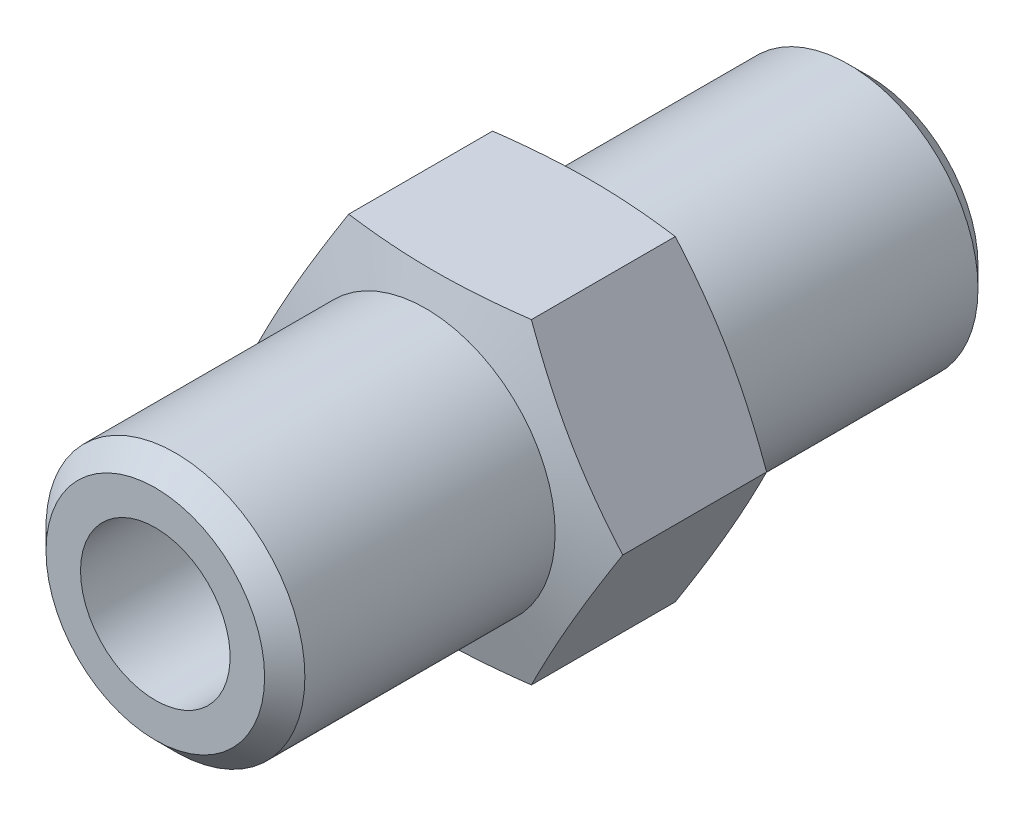
ISO-10303-21;
HEADER;
FILE_DESCRIPTION(('STEP AP214'),'2;1');
FILE_NAME('part.step','',(''),(''),'','','');
FILE_SCHEMA(('AUTOMOTIVE_DESIGN { 1 0 10303 214 1 1 1 1 }'));
ENDSEC;
DATA;
#1=APPLICATION_CONTEXT('core data for automotive mechanical design processes');
#2=APPLICATION_PROTOCOL_DEFINITION('international standard','automotive_design',2000,#1);
#3=PRODUCT_CONTEXT('',#1,'mechanical');
#4=PRODUCT('Part','Part','',(#3));
#5=PRODUCT_RELATED_PRODUCT_CATEGORY('part','',(#4));
#6=PRODUCT_DEFINITION_FORMATION('','',#4);
#7=PRODUCT_DEFINITION_CONTEXT('part definition',#1,'design');
#8=PRODUCT_DEFINITION('design','',#6,#7);
#9=PRODUCT_DEFINITION_SHAPE('','',#8);
#10=(LENGTH_UNIT() NAMED_UNIT(*) SI_UNIT(.MILLI.,.METRE.));
#11=(NAMED_UNIT(*) PLANE_ANGLE_UNIT() SI_UNIT($,.RADIAN.));
#12=(NAMED_UNIT(*) SI_UNIT($,.STERADIAN.) SOLID_ANGLE_UNIT());
#13=UNCERTAINTY_MEASURE_WITH_UNIT(LENGTH_MEASURE(1.E-05),#10,'distance_accuracy_value','');
#14=(GEOMETRIC_REPRESENTATION_CONTEXT(3) GLOBAL_UNCERTAINTY_ASSIGNED_CONTEXT((#13)) GLOBAL_UNIT_ASSIGNED_CONTEXT((#10,
#11,#12)) REPRESENTATION_CONTEXT('',''));
#15=CARTESIAN_POINT('',(0.,0.,0.));
#16=DIRECTION('',(0.,0.,1.));
#17=DIRECTION('',(1.,0.,0.));
#18=AXIS2_PLACEMENT_3D('',#15,#16,#17);
#19=CARTESIAN_POINT('',(3.17542648054292,-5.50000000000003,3.));
#20=DIRECTION('',(-0.86602540378444,0.499999999999998,0.));
#21=DIRECTION('',(-0.499999999999998,-0.86602540378444,0.));
#22=AXIS2_PLACEMENT_3D('',#19,#20,#21);
#23=PLANE('',#22);
#24=CARTESIAN_POINT('',(6.35096843113971,0.00020000000001517,-2.49996880540882));
#25=CARTESIAN_POINT('',(6.21909857753245,-0.228205286434418,-2.53560827067485));
#26=CARTESIAN_POINT('',(6.08698575690806,-0.457031404087093,-2.56796434186976));
#27=CARTESIAN_POINT('',(5.82228587664242,-0.915505045464598,-2.62481250126896));
#28=CARTESIAN_POINT('',(5.68969864384062,-1.14515286911228,-2.64930133971248));
#29=CARTESIAN_POINT('',(5.42486694275772,-1.60385483084275,-2.68898192793889));
#30=CARTESIAN_POINT('',(5.29262432452593,-1.83290576454614,-2.70422177046429));
#31=CARTESIAN_POINT('',(5.02796768521281,-2.2913045103969,-2.7246569593401));
#32=CARTESIAN_POINT('',(4.8955537030136,-2.52065225519845,-2.7298542831265));
#33=CARTESIAN_POINT('',(4.63072573861518,-2.97934774480156,-2.7298542831265));
#34=CARTESIAN_POINT('',(4.49831175641597,-3.20869548960311,-2.7246569593401));
#35=CARTESIAN_POINT('',(4.23365511710285,-3.66709423545387,-2.70422177046429));
#36=CARTESIAN_POINT('',(4.10141249887106,-3.89614516915726,-2.68898192793888));
#37=CARTESIAN_POINT('',(3.83658079778817,-4.35484713088773,-2.64930133971248));
#38=CARTESIAN_POINT('',(3.70399356498637,-4.58449495453541,-2.62481250126896));
#39=CARTESIAN_POINT('',(3.43929368472072,-5.04296859591292,-2.56796434186975));
#40=CARTESIAN_POINT('',(3.30718086409633,-5.27179471356559,-2.53560827067485));
#41=CARTESIAN_POINT('',(3.17531101048908,-5.50020000000003,-2.49996880540881));
#42=B_SPLINE_CURVE_WITH_KNOTS('',3,(#24,#25,#26,#27,#28,#29,#30,#31,#32,#33,#34,#35,#36,#37,#38,
#39,#40,#41),.UNSPECIFIED.,.F.,.F.,(4,2,2,2,2,2,2,2,4),(0.,0.798453028022411,1.59723545457054,
2.39182798445062,3.18626403804335,3.98070009163608,4.77529262151615,5.57407504806429,
6.3725280760867),.UNSPECIFIED.);
#43=CARTESIAN_POINT('',(6.35085296108592,0.,-2.5));
#44=VERTEX_POINT('',#43);
#45=CARTESIAN_POINT('',(3.17542648054292,-5.50000000000003,-2.5));
#46=VERTEX_POINT('',#45);
#47=EDGE_CURVE('E50',#44,#46,#42,.T.);
#48=ORIENTED_EDGE('',*,*,#47,.F.);
#49=DIRECTION('',(0.,0.,-1.));
#50=VECTOR('',#49,1.);
#51=CARTESIAN_POINT('',(6.35085296108587,0.,3.));
#52=LINE('',#51,#50);
#53=CARTESIAN_POINT('',(6.35085296108592,0.,2.5));
#54=VERTEX_POINT('',#53);
#55=EDGE_CURVE('E99',#54,#44,#52,.T.);
#56=ORIENTED_EDGE('',*,*,#55,.F.);
#57=CARTESIAN_POINT('',(3.17531101048908,-5.50020000000003,2.49996880540881));
#58=CARTESIAN_POINT('',(3.30718086409633,-5.27179471356559,2.53560827067485));
#59=CARTESIAN_POINT('',(3.43929368472072,-5.04296859591292,2.56796434186975));
#60=CARTESIAN_POINT('',(3.70399356498637,-4.58449495453541,2.62481250126896));
#61=CARTESIAN_POINT('',(3.83658079778817,-4.35484713088773,2.64930133971248));
#62=CARTESIAN_POINT('',(4.10141249887106,-3.89614516915726,2.68898192793889));
#63=CARTESIAN_POINT('',(4.23365511710285,-3.66709423545387,2.70422177046429));
#64=CARTESIAN_POINT('',(4.49831175641597,-3.20869548960311,2.7246569593401));
#65=CARTESIAN_POINT('',(4.63072573861518,-2.97934774480156,2.7298542831265));
#66=CARTESIAN_POINT('',(4.8955537030136,-2.52065225519845,2.7298542831265));
#67=CARTESIAN_POINT('',(5.02796768521281,-2.2913045103969,2.7246569593401));
#68=CARTESIAN_POINT('',(5.29262432452594,-1.83290576454614,2.70422177046429));
#69=CARTESIAN_POINT('',(5.42486694275772,-1.60385483084275,2.68898192793889));
#70=CARTESIAN_POINT('',(5.68969864384062,-1.14515286911228,2.64930133971248));
#71=CARTESIAN_POINT('',(5.82228587664242,-0.915505045464597,2.62481250126896));
#72=CARTESIAN_POINT('',(6.08698575690807,-0.457031404087092,2.56796434186976));
#73=CARTESIAN_POINT('',(6.21909857753245,-0.228205286434417,2.53560827067485));
#74=CARTESIAN_POINT('',(6.35096843113971,0.000200000000016106,2.49996880540882));
#75=B_SPLINE_CURVE_WITH_KNOTS('',3,(#57,#58,#59,#60,#61,#62,#63,#64,#65,#66,#67,#68,#69,#70,#71,
#72,#73,#74),.UNSPECIFIED.,.F.,.F.,(4,2,2,2,2,2,2,2,4),(0.,0.79845302802241,1.59723545457054,
2.39182798445062,3.18626403804335,3.98070009163608,4.77529262151615,5.57407504806429,
6.3725280760867),.UNSPECIFIED.);
#76=CARTESIAN_POINT('',(3.17542648054298,-5.50000000000003,2.5));
#77=VERTEX_POINT('',#76);
#78=EDGE_CURVE('E144',#77,#54,#75,.T.);
#79=ORIENTED_EDGE('',*,*,#78,.F.);
#80=DIRECTION('',(0.,0.,-1.));
#81=VECTOR('',#80,1.);
#82=CARTESIAN_POINT('',(3.17542648054292,-5.50000000000003,3.));
#83=LINE('',#82,#81);
#84=EDGE_CURVE('E101',#77,#46,#83,.T.);
#85=ORIENTED_EDGE('',*,*,#84,.T.);
#86=EDGE_LOOP('',(#48,#56,#79,#85));
#87=FACE_BOUND('',#86,.T.);
#88=ADVANCED_FACE('F35',(#87),#23,.F.);
#89=CARTESIAN_POINT('',(6.35085296108587,0.,3.));
#90=DIRECTION('',(-0.866025403784438,-0.500000000000001,0.));
#91=DIRECTION('',(0.500000000000001,-0.866025403784438,0.));
#92=AXIS2_PLACEMENT_3D('',#89,#90,#91);
#93=PLANE('',#92);
#94=CARTESIAN_POINT('',(3.17531101048906,5.50020000000005,-2.49996880540881));
#95=CARTESIAN_POINT('',(3.30718086409631,5.27179471356561,-2.53560827067484));
#96=CARTESIAN_POINT('',(3.4392936847207,5.04296859591294,-2.56796434186975));
#97=CARTESIAN_POINT('',(3.70399356498635,4.58449495453543,-2.62481250126896));
#98=CARTESIAN_POINT('',(3.83658079778815,4.35484713088775,-2.64930133971247));
#99=CARTESIAN_POINT('',(4.10141249887105,3.89614516915728,-2.68898192793888));
#100=CARTESIAN_POINT('',(4.23365511710284,3.66709423545389,-2.70422177046428));
#101=CARTESIAN_POINT('',(4.49831175641596,3.20869548960313,-2.7246569593401));
#102=CARTESIAN_POINT('',(4.63072573861518,2.97934774480158,-2.7298542831265));
#103=CARTESIAN_POINT('',(4.8955537030136,2.52065225519847,-2.7298542831265));
#104=CARTESIAN_POINT('',(5.02796768521281,2.29130451039692,-2.7246569593401));
#105=CARTESIAN_POINT('',(5.29262432452593,1.83290576454615,-2.70422177046429));
#106=CARTESIAN_POINT('',(5.42486694275772,1.60385483084276,-2.68898192793889));
#107=CARTESIAN_POINT('',(5.68969864384062,1.14515286911229,-2.64930133971248));
#108=CARTESIAN_POINT('',(5.82228587664242,0.915505045464613,-2.62481250126896));
#109=CARTESIAN_POINT('',(6.08698575690807,0.457031404087108,-2.56796434186976));
#110=CARTESIAN_POINT('',(6.21909857753246,0.228205286434434,-2.53560827067485));
#111=CARTESIAN_POINT('',(6.35096843113971,-0.000200000000000651,-2.49996880540882));
#112=B_SPLINE_CURVE_WITH_KNOTS('',3,(#94,#95,#96,#97,#98,#99,#100,#101,#102,#103,#104,#105,#106,
#107,#108,#109,#110,#111),.UNSPECIFIED.,.F.,.F.,(4,2,2,2,2,2,2,2,4),(0.,0.798453028022413,
1.59723545457055,2.39182798445063,3.18626403804336,3.98070009163609,4.77529262151617,
5.5740750480643,6.37252807608672),.UNSPECIFIED.);
#113=CARTESIAN_POINT('',(3.17542648054294,5.50000000000005,-2.5));
#114=VERTEX_POINT('',#113);
#115=EDGE_CURVE('E86',#114,#44,#112,.T.);
#116=ORIENTED_EDGE('',*,*,#115,.F.);
#117=DIRECTION('',(0.,0.,-1.));
#118=VECTOR('',#117,1.);
#119=CARTESIAN_POINT('',(3.1754264805429,5.50000000000005,3.));
#120=LINE('',#119,#118);
#121=CARTESIAN_POINT('',(3.17542648054294,5.50000000000005,2.5));
#122=VERTEX_POINT('',#121);
#123=EDGE_CURVE('E108',#122,#114,#120,.T.);
#124=ORIENTED_EDGE('',*,*,#123,.F.);
#125=CARTESIAN_POINT('',(6.35096843113971,-0.000199999999984875,2.49996880540882));
#126=CARTESIAN_POINT('',(6.21909857753245,0.228205286434449,2.53560827067485));
#127=CARTESIAN_POINT('',(6.08698575690806,0.457031404087123,2.56796434186976));
#128=CARTESIAN_POINT('',(5.82228587664241,0.915505045464627,2.62481250126896));
#129=CARTESIAN_POINT('',(5.68969864384061,1.14515286911231,2.64930133971248));
#130=CARTESIAN_POINT('',(5.42486694275772,1.60385483084277,2.68898192793889));
#131=CARTESIAN_POINT('',(5.29262432452593,1.83290576454616,2.70422177046429));
#132=CARTESIAN_POINT('',(5.0279676852128,2.29130451039693,2.7246569593401));
#133=CARTESIAN_POINT('',(4.89555370301359,2.52065225519848,2.7298542831265));
#134=CARTESIAN_POINT('',(4.63072573861517,2.97934774480158,2.7298542831265));
#135=CARTESIAN_POINT('',(4.49831175641596,3.20869548960314,2.7246569593401));
#136=CARTESIAN_POINT('',(4.23365511710284,3.6670942354539,2.70422177046428));
#137=CARTESIAN_POINT('',(4.10141249887105,3.89614516915729,2.68898192793888));
#138=CARTESIAN_POINT('',(3.83658079778815,4.35484713088776,2.64930133971247));
#139=CARTESIAN_POINT('',(3.70399356498635,4.58449495453544,2.62481250126896));
#140=CARTESIAN_POINT('',(3.4392936847207,5.04296859591294,2.56796434186975));
#141=CARTESIAN_POINT('',(3.30718086409631,5.27179471356561,2.53560827067484));
#142=CARTESIAN_POINT('',(3.17531101048906,5.50020000000005,2.49996880540881));
#143=B_SPLINE_CURVE_WITH_KNOTS('',3,(#125,#126,#127,#128,#129,#130,#131,#132,#133,#134,#135,
#136,#137,#138,#139,#140,#141,#142),.UNSPECIFIED.,.F.,.F.,(4,2,2,2,2,2,2,2,4),(0.,
0.798453028022411,1.59723545457054,2.39182798445062,3.18626403804335,3.98070009163608,
4.77529262151615,5.57407504806429,6.3725280760867),.UNSPECIFIED.);
#144=EDGE_CURVE('E106',#54,#122,#143,.T.);
#145=ORIENTED_EDGE('',*,*,#144,.F.);
#146=ORIENTED_EDGE('',*,*,#55,.T.);
#147=EDGE_LOOP('',(#116,#124,#145,#146));
#148=FACE_BOUND('',#147,.T.);
#149=ADVANCED_FACE('F105',(#148),#93,.F.);
#150=CARTESIAN_POINT('',(3.1754264805429,5.50000000000005,3.));
#151=DIRECTION('',(0.,-1.,0.));
#152=DIRECTION('',(0.,0.,-1.));
#153=AXIS2_PLACEMENT_3D('',#150,#151,#152);
#154=PLANE('',#153);
#155=CARTESIAN_POINT('',(-8.37604764917882,5.50000000000005,-1.50869084585545));
#156=CARTESIAN_POINT('',(-8.12680145019275,5.50000000000005,-1.56495914991918));
#157=CARTESIAN_POINT('',(-7.87739624035822,5.50000000000005,-1.62053578772309));
#158=CARTESIAN_POINT('',(-7.37818970420281,5.50000000000005,-1.72993219848236));
#159=CARTESIAN_POINT('',(-7.12838836084236,5.50000000000005,-1.78375189358873));
#160=CARTESIAN_POINT('',(-6.62808086018437,5.50000000000005,-1.88930914543803));
#161=CARTESIAN_POINT('',(-6.37757424575021,5.50000000000005,-1.9410445432589));
#162=CARTESIAN_POINT('',(-5.87602950686094,5.50000000000005,-2.04186994899429));
#163=CARTESIAN_POINT('',(-5.62499138703514,5.50000000000005,-2.09095997985181));
#164=CARTESIAN_POINT('',(-5.1243510925801,5.50000000000005,-2.18547555450788));
#165=CARTESIAN_POINT('',(-4.87475398508629,5.50000000000005,-2.23092780578391));
#166=CARTESIAN_POINT('',(-4.37486670922052,5.50000000000005,-2.31783907452348));
#167=CARTESIAN_POINT('',(-4.12457655659067,5.50000000000005,-2.35929818193585));
#168=CARTESIAN_POINT('',(-3.6232563207886,5.50000000000005,-2.43728407256187));
#169=CARTESIAN_POINT('',(-3.37222634027827,5.50000000000005,-2.47381150996572));
#170=CARTESIAN_POINT('',(-2.86935537269727,5.50000000000005,-2.54085242863196));
#171=CARTESIAN_POINT('',(-2.61751438494814,5.50000000000005,-2.571365904862));
#172=CARTESIAN_POINT('',(-2.11013760742528,5.50000000000005,-2.62551391211825));
#173=CARTESIAN_POINT('',(-1.8545927606818,5.50000000000005,-2.64906484304505));
#174=CARTESIAN_POINT('',(-1.34285532977527,5.50000000000005,-2.68764901723002));
#175=CARTESIAN_POINT('',(-1.08666276091749,5.50000000000005,-2.70268245989629));
#176=CARTESIAN_POINT('',(-0.574007904718304,5.50000000000005,-2.72335257203808));
#177=CARTESIAN_POINT('',(-0.317545793347686,5.50000000000005,-2.72899351786242));
#178=CARTESIAN_POINT('',(0.195408150510478,5.50000000000005,-2.73053187554643));
#179=CARTESIAN_POINT('',(0.451899982987166,5.50000000000005,-2.72642929095471));
#180=CARTESIAN_POINT('',(0.965509156636248,5.50000000000005,-2.7087110378046));
#181=CARTESIAN_POINT('',(1.22262524669248,5.50000000000005,-2.69505982707376));
#182=CARTESIAN_POINT('',(1.73623879652311,5.50000000000005,-2.65902181815087));
#183=CARTESIAN_POINT('',(1.99273624231407,5.50000000000005,-2.63663482432854));
#184=CARTESIAN_POINT('',(2.50511237094907,5.50000000000005,-2.58425144800659));
#185=CARTESIAN_POINT('',(2.76099053216907,5.50000000000005,-2.55425004111006));
#186=CARTESIAN_POINT('',(3.2719105634027,5.50000000000005,-2.48788021733587));
#187=CARTESIAN_POINT('',(3.52695243099645,5.50000000000005,-2.45151178205128));
#188=CARTESIAN_POINT('',(4.02090404693948,5.50000000000005,-2.3759102253628));
#189=CARTESIAN_POINT('',(4.25986081942583,5.50000000000005,-2.3369812829339));
#190=CARTESIAN_POINT('',(4.73713253888051,5.50000000000005,-2.25535241820544));
#191=CARTESIAN_POINT('',(4.97544746766028,5.50000000000005,-2.21265239017578));
#192=CARTESIAN_POINT('',(5.45152539276521,5.50000000000005,-2.12417526713858));
#193=CARTESIAN_POINT('',(5.6892883361756,5.50000000000005,-2.07839788878471));
#194=CARTESIAN_POINT('',(6.16431794625488,5.50000000000005,-1.98433087059592));
#195=CARTESIAN_POINT('',(6.40158460634305,5.50000000000005,-1.93604119766484));
#196=CARTESIAN_POINT('',(7.11285504480321,5.50000000000005,-1.78808911835104));
#197=CARTESIAN_POINT('',(7.58622111316099,5.50000000000005,-1.68536421558975));
#198=CARTESIAN_POINT('',(8.5316777617362,5.50000000000005,-1.47438969598058));
#199=CARTESIAN_POINT('',(9.003768416739,5.50000000000005,-1.36614041080457));
#200=CARTESIAN_POINT('',(9.94222166980468,5.50000000000005,-1.14687990319113));
#201=CARTESIAN_POINT('',(10.4085935229104,5.50000000000005,-1.03590818449741));
#202=CARTESIAN_POINT('',(11.3406801840764,5.50000000000005,-0.811209444707597));
#203=CARTESIAN_POINT('',(11.806394979696,5.50000000000005,-0.697482372163423));
#204=CARTESIAN_POINT('',(12.7367389906961,5.50000000000005,-0.468137481058403));
#205=CARTESIAN_POINT('',(13.2013688351624,5.50000000000005,-0.352522209350266));
#206=CARTESIAN_POINT('',(14.1302201586133,5.50000000000005,-0.119727189775686));
#207=CARTESIAN_POINT('',(14.5944416507604,5.50000000000005,-0.00254749446411019));
#208=CARTESIAN_POINT('',(15.0585209823324,5.50000000000005,0.115185855876627));
#209=B_SPLINE_CURVE_WITH_KNOTS('',3,(#155,#156,#157,#158,#159,#160,#161,#162,#163,#164,#165,
#166,#167,#168,#169,#170,#171,#172,#173,#174,#175,#176,#177,#178,#179,#180,#181,#182,#183,#184,
#185,#186,#187,#188,#189,#190,#191,#192,#193,#194,#195,#196,#197,#198,#199,#200,#201,#202,#203,
#204,#205,#206,#207,#208),.UNSPECIFIED.,.F.,.F.,(4,2,2,2,2,2,2,2,2,2,2,2,2,2,2,2,2,2,2,2,2,2,2,
2,2,2,4),(0.,0.766559204635087,1.53315232903127,2.30052008367675,3.06788118194892,
3.82896078601792,4.59002324213275,5.35098464327108,6.11194668116364,6.8817056275536,
7.65144655190546,8.42083692179503,9.19022701147073,9.96249629346691,10.7347828707559,
11.5075803749602,12.280380113341,13.0066653942776,13.7329710445748,14.4593436611396,
15.1857258491315,16.6388204904091,18.0918279934541,19.5299944417313,20.9681877642431,
22.4045795623671,23.8409232275095),.UNSPECIFIED.);
#210=CARTESIAN_POINT('',(-3.17542648054296,5.50000000000003,-2.5));
#211=VERTEX_POINT('',#210);
#212=EDGE_CURVE('E89',#211,#114,#209,.T.);
#213=ORIENTED_EDGE('',*,*,#212,.F.);
#214=DIRECTION('',(0.,0.,-1.));
#215=VECTOR('',#214,1.);
#216=CARTESIAN_POINT('',(-3.17542648054295,5.50000000000005,3.));
#217=LINE('',#216,#215);
#218=CARTESIAN_POINT('',(-3.17542648054296,5.50000000000003,2.5));
#219=VERTEX_POINT('',#218);
#220=EDGE_CURVE('E113',#219,#211,#217,.T.);
#221=ORIENTED_EDGE('',*,*,#220,.F.);
#222=CARTESIAN_POINT('',(-8.37604764917882,5.50000000000005,1.50869084585545));
#223=CARTESIAN_POINT('',(-8.12680145019275,5.50000000000005,1.56495914991918));
#224=CARTESIAN_POINT('',(-7.87739624035822,5.50000000000005,1.62053578772309));
#225=CARTESIAN_POINT('',(-7.37818970420281,5.50000000000005,1.72993219848236));
#226=CARTESIAN_POINT('',(-7.12838836084236,5.50000000000005,1.78375189358873));
#227=CARTESIAN_POINT('',(-6.62808086018437,5.50000000000005,1.88930914543803));
#228=CARTESIAN_POINT('',(-6.37757424575021,5.50000000000005,1.9410445432589));
#229=CARTESIAN_POINT('',(-5.87602950686094,5.50000000000005,2.04186994899429));
#230=CARTESIAN_POINT('',(-5.62499138703514,5.50000000000005,2.09095997985181));
#231=CARTESIAN_POINT('',(-5.1243510925801,5.50000000000005,2.18547555450788));
#232=CARTESIAN_POINT('',(-4.8747539850863,5.50000000000005,2.23092780578391));
#233=CARTESIAN_POINT('',(-4.37486670922052,5.50000000000005,2.31783907452348));
#234=CARTESIAN_POINT('',(-4.12457655659067,5.50000000000005,2.35929818193585));
#235=CARTESIAN_POINT('',(-3.6232563207886,5.50000000000005,2.43728407256187));
#236=CARTESIAN_POINT('',(-3.37222634027827,5.50000000000005,2.47381150996572));
#237=CARTESIAN_POINT('',(-2.86935537269727,5.50000000000005,2.54085242863196));
#238=CARTESIAN_POINT('',(-2.61751438494814,5.50000000000005,2.571365904862));
#239=CARTESIAN_POINT('',(-2.11013760742528,5.50000000000005,2.62551391211825));
#240=CARTESIAN_POINT('',(-1.85459276068179,5.50000000000005,2.64906484304505));
#241=CARTESIAN_POINT('',(-1.34285532977526,5.50000000000005,2.68764901723002));
#242=CARTESIAN_POINT('',(-1.08666276091749,5.50000000000005,2.70268245989629));
#243=CARTESIAN_POINT('',(-0.5740079047183,5.50000000000005,2.72335257203808));
#244=CARTESIAN_POINT('',(-0.317545793347681,5.50000000000005,2.72899351786242));
#245=CARTESIAN_POINT('',(0.195408150510483,5.50000000000005,2.73053187554643));
#246=CARTESIAN_POINT('',(0.451899982987171,5.50000000000005,2.72642929095471));
#247=CARTESIAN_POINT('',(0.965509156636253,5.50000000000005,2.7087110378046));
#248=CARTESIAN_POINT('',(1.22262524669248,5.50000000000005,2.69505982707376));
#249=CARTESIAN_POINT('',(1.73623879652311,5.50000000000005,2.65902181815087));
#250=CARTESIAN_POINT('',(1.99273624231407,5.50000000000005,2.63663482432854));
#251=CARTESIAN_POINT('',(2.50511237094908,5.50000000000005,2.58425144800659));
#252=CARTESIAN_POINT('',(2.76099053216908,5.50000000000005,2.55425004111006));
#253=CARTESIAN_POINT('',(3.27191056340271,5.50000000000005,2.48788021733587));
#254=CARTESIAN_POINT('',(3.52695243099646,5.50000000000005,2.45151178205128));
#255=CARTESIAN_POINT('',(4.02090404693948,5.50000000000005,2.3759102253628));
#256=CARTESIAN_POINT('',(4.25986081942583,5.50000000000005,2.3369812829339));
#257=CARTESIAN_POINT('',(4.7371325388805,5.50000000000005,2.25535241820544));
#258=CARTESIAN_POINT('',(4.97544746766027,5.50000000000005,2.21265239017578));
#259=CARTESIAN_POINT('',(5.4515253927652,5.50000000000005,2.12417526713858));
#260=CARTESIAN_POINT('',(5.68928833617558,5.50000000000005,2.07839788878471));
#261=CARTESIAN_POINT('',(6.16431794625486,5.50000000000005,1.98433087059593));
#262=CARTESIAN_POINT('',(6.40158460634302,5.50000000000005,1.93604119766484));
#263=CARTESIAN_POINT('',(7.11285504480318,5.50000000000005,1.78808911835105));
#264=CARTESIAN_POINT('',(7.58622111316096,5.50000000000005,1.68536421558975));
#265=CARTESIAN_POINT('',(8.53167776173616,5.50000000000005,1.47438969598059));
#266=CARTESIAN_POINT('',(9.00376841673895,5.50000000000005,1.36614041080458));
#267=CARTESIAN_POINT('',(9.94222166980463,5.50000000000005,1.14687990319114));
#268=CARTESIAN_POINT('',(10.4085935229104,5.50000000000005,1.03590818449742));
#269=CARTESIAN_POINT('',(11.3406801840763,5.50000000000005,0.811209444707612));
#270=CARTESIAN_POINT('',(11.8063949796959,5.50000000000005,0.697482372163439));
#271=CARTESIAN_POINT('',(12.7367389906961,5.50000000000005,0.46813748105842));
#272=CARTESIAN_POINT('',(13.2013688351623,5.50000000000005,0.352522209350284));
#273=CARTESIAN_POINT('',(14.1302201586133,5.50000000000005,0.119727189775706));
#274=CARTESIAN_POINT('',(14.5944416507604,5.50000000000005,0.00254749446413092));
#275=CARTESIAN_POINT('',(15.0585209823323,5.50000000000005,-0.115185855876605));
#276=B_SPLINE_CURVE_WITH_KNOTS('',3,(#222,#223,#224,#225,#226,#227,#228,#229,#230,#231,#232,
#233,#234,#235,#236,#237,#238,#239,#240,#241,#242,#243,#244,#245,#246,#247,#248,#249,#250,#251,
#252,#253,#254,#255,#256,#257,#258,#259,#260,#261,#262,#263,#264,#265,#266,#267,#268,#269,#270,
#271,#272,#273,#274,#275),.UNSPECIFIED.,.F.,.F.,(4,2,2,2,2,2,2,2,2,2,2,2,2,2,2,2,2,2,2,2,2,2,2,
2,2,2,4),(0.,0.766559204635087,1.53315232903128,2.30052008367675,3.06788118194891,
3.82896078601792,4.59002324213275,5.35098464327108,6.11194668116364,6.88170562755361,
7.65144655190546,8.42083692179503,9.19022701147073,9.96249629346692,10.7347828707559,
11.5075803749602,12.280380113341,13.0066653942776,13.7329710445748,14.4593436611396,
15.1857258491315,16.638820490409,18.0918279934541,19.5299944417313,20.9681877642431,
22.404579562367,23.8409232275094),.UNSPECIFIED.);
#277=EDGE_CURVE('E202',#122,#219,#276,.F.);
#278=ORIENTED_EDGE('',*,*,#277,.F.);
#279=ORIENTED_EDGE('',*,*,#123,.T.);
#280=EDGE_LOOP('',(#213,#221,#278,#279));
#281=FACE_BOUND('',#280,.T.);
#282=ADVANCED_FACE('F137',(#281),#154,.F.);
#283=CARTESIAN_POINT('',(-3.17542648054295,5.50000000000005,3.));
#284=DIRECTION('',(0.866025403784439,-0.499999999999999,0.));
#285=DIRECTION('',(0.499999999999999,0.866025403784439,0.));
#286=AXIS2_PLACEMENT_3D('',#283,#284,#285);
#287=PLANE('',#286);
#288=CARTESIAN_POINT('',(-6.35096843113976,-0.00020000000000847,-2.49996880540881));
#289=CARTESIAN_POINT('',(-6.21909857753251,0.228205286434426,-2.53560827067484));
#290=CARTESIAN_POINT('',(-6.08698575690812,0.457031404087101,-2.56796434186974));
#291=CARTESIAN_POINT('',(-5.82228587664247,0.915505045464607,-2.62481250126895));
#292=CARTESIAN_POINT('',(-5.68969864384067,1.14515286911229,-2.64930133971247));
#293=CARTESIAN_POINT('',(-5.42486694275777,1.60385483084276,-2.68898192793888));
#294=CARTESIAN_POINT('',(-5.29262432452598,1.83290576454615,-2.70422177046427));
#295=CARTESIAN_POINT('',(-5.02796768521286,2.29130451039691,-2.72465695934009));
#296=CARTESIAN_POINT('',(-4.89555370301365,2.52065225519847,-2.72985428312649));
#297=CARTESIAN_POINT('',(-4.63072573861523,2.97934774480157,-2.72985428312649));
#298=CARTESIAN_POINT('',(-4.49831175641602,3.20869548960313,-2.72465695934009));
#299=CARTESIAN_POINT('',(-4.23365511710289,3.66709423545389,-2.70422177046427));
#300=CARTESIAN_POINT('',(-4.10141249887111,3.89614516915728,-2.68898192793887));
#301=CARTESIAN_POINT('',(-3.83658079778821,4.35484713088775,-2.64930133971246));
#302=CARTESIAN_POINT('',(-3.70399356498641,4.58449495453543,-2.62481250126895));
#303=CARTESIAN_POINT('',(-3.43929368472076,5.04296859591294,-2.56796434186974));
#304=CARTESIAN_POINT('',(-3.30718086409637,5.27179471356561,-2.53560827067484));
#305=CARTESIAN_POINT('',(-3.17531101048912,5.50020000000005,-2.4999688054088));
#306=B_SPLINE_CURVE_WITH_KNOTS('',3,(#288,#289,#290,#291,#292,#293,#294,#295,#296,#297,#298,
#299,#300,#301,#302,#303,#304,#305),.UNSPECIFIED.,.F.,.F.,(4,2,2,2,2,2,2,2,4),(0.,
0.798453028022413,1.59723545457055,2.39182798445063,3.18626403804336,3.98070009163609,
4.77529262151617,5.5740750480643,6.37252807608672),.UNSPECIFIED.);
#307=CARTESIAN_POINT('',(-6.35085296108592,0.,-2.5));
#308=VERTEX_POINT('',#307);
#309=EDGE_CURVE('E187',#308,#211,#306,.T.);
#310=ORIENTED_EDGE('',*,*,#309,.F.);
#311=DIRECTION('',(0.,0.,-1.));
#312=VECTOR('',#311,1.);
#313=CARTESIAN_POINT('',(-6.35085296108592,0.,3.));
#314=LINE('',#313,#312);
#315=CARTESIAN_POINT('',(-6.35085296108592,0.,2.5));
#316=VERTEX_POINT('',#315);
#317=EDGE_CURVE('E271',#316,#308,#314,.T.);
#318=ORIENTED_EDGE('',*,*,#317,.F.);
#319=CARTESIAN_POINT('',(-3.17531101048912,5.50020000000005,2.4999688054088));
#320=CARTESIAN_POINT('',(-3.30718086409637,5.27179471356561,2.53560827067484));
#321=CARTESIAN_POINT('',(-3.43929368472076,5.04296859591294,2.56796434186974));
#322=CARTESIAN_POINT('',(-3.70399356498641,4.58449495453543,2.62481250126895));
#323=CARTESIAN_POINT('',(-3.83658079778821,4.35484713088775,2.64930133971246));
#324=CARTESIAN_POINT('',(-4.10141249887111,3.89614516915728,2.68898192793887));
#325=CARTESIAN_POINT('',(-4.23365511710289,3.66709423545389,2.70422177046427));
#326=CARTESIAN_POINT('',(-4.49831175641602,3.20869548960313,2.72465695934009));
#327=CARTESIAN_POINT('',(-4.63072573861523,2.97934774480157,2.72985428312649));
#328=CARTESIAN_POINT('',(-4.89555370301365,2.52065225519847,2.72985428312649));
#329=CARTESIAN_POINT('',(-5.02796768521286,2.29130451039691,2.72465695934009));
#330=CARTESIAN_POINT('',(-5.29262432452598,1.83290576454615,2.70422177046427));
#331=CARTESIAN_POINT('',(-5.42486694275777,1.60385483084276,2.68898192793888));
#332=CARTESIAN_POINT('',(-5.68969864384067,1.14515286911229,2.64930133971247));
#333=CARTESIAN_POINT('',(-5.82228587664247,0.915505045464609,2.62481250126895));
#334=CARTESIAN_POINT('',(-6.08698575690812,0.457031404087103,2.56796434186974));
#335=CARTESIAN_POINT('',(-6.21909857753251,0.228205286434428,2.53560827067484));
#336=CARTESIAN_POINT('',(-6.35096843113976,-0.000200000000006428,2.49996880540881));
#337=B_SPLINE_CURVE_WITH_KNOTS('',3,(#319,#320,#321,#322,#323,#324,#325,#326,#327,#328,#329,
#330,#331,#332,#333,#334,#335,#336),.UNSPECIFIED.,.F.,.F.,(4,2,2,2,2,2,2,2,4),(0.,
0.798453028022412,1.59723545457055,2.39182798445062,3.18626403804336,3.98070009163609,
4.77529262151616,5.5740750480643,6.37252807608671),.UNSPECIFIED.);
#338=EDGE_CURVE('E207',#219,#316,#337,.T.);
#339=ORIENTED_EDGE('',*,*,#338,.F.);
#340=ORIENTED_EDGE('',*,*,#220,.T.);
#341=EDGE_LOOP('',(#310,#318,#339,#340));
#342=FACE_BOUND('',#341,.T.);
#343=ADVANCED_FACE('F197',(#342),#287,.F.);
#344=CARTESIAN_POINT('',(-6.35085296108592,0.,3.));
#345=DIRECTION('',(0.866025403784438,0.500000000000002,0.));
#346=DIRECTION('',(-0.500000000000002,0.866025403784438,0.));
#347=AXIS2_PLACEMENT_3D('',#344,#345,#346);
#348=PLANE('',#347);
#349=CARTESIAN_POINT('',(-3.17531101048912,-5.50020000000003,-2.49996880540881));
#350=CARTESIAN_POINT('',(-3.30718086409637,-5.27179471356559,-2.53560827067484));
#351=CARTESIAN_POINT('',(-3.43929368472076,-5.04296859591292,-2.56796434186975));
#352=CARTESIAN_POINT('',(-3.70399356498641,-4.58449495453542,-2.62481250126895));
#353=CARTESIAN_POINT('',(-3.83658079778821,-4.35484713088774,-2.64930133971247));
#354=CARTESIAN_POINT('',(-4.10141249887111,-3.89614516915727,-2.68898192793888));
#355=CARTESIAN_POINT('',(-4.2336551171029,-3.66709423545388,-2.70422177046427));
#356=CARTESIAN_POINT('',(-4.49831175641602,-3.20869548960312,-2.72465695934009));
#357=CARTESIAN_POINT('',(-4.63072573861523,-2.97934774480157,-2.72985428312649));
#358=CARTESIAN_POINT('',(-4.89555370301365,-2.52065225519847,-2.72985428312649));
#359=CARTESIAN_POINT('',(-5.02796768521286,-2.29130451039691,-2.72465695934009));
#360=CARTESIAN_POINT('',(-5.29262432452598,-1.83290576454615,-2.70422177046427));
#361=CARTESIAN_POINT('',(-5.42486694275777,-1.60385483084276,-2.68898192793887));
#362=CARTESIAN_POINT('',(-5.68969864384067,-1.1451528691123,-2.64930133971247));
#363=CARTESIAN_POINT('',(-5.82228587664247,-0.915505045464618,-2.62481250126895));
#364=CARTESIAN_POINT('',(-6.08698575690812,-0.457031404087115,-2.56796434186974));
#365=CARTESIAN_POINT('',(-6.21909857753251,-0.228205286434442,-2.53560827067484));
#366=CARTESIAN_POINT('',(-6.35096843113976,0.000199999999990981,-2.49996880540881));
#367=B_SPLINE_CURVE_WITH_KNOTS('',3,(#349,#350,#351,#352,#353,#354,#355,#356,#357,#358,#359,
#360,#361,#362,#363,#364,#365,#366),.UNSPECIFIED.,.F.,.F.,(4,2,2,2,2,2,2,2,4),(0.,
0.798453028022409,1.59723545457054,2.39182798445061,3.18626403804334,3.98070009163607,
4.77529262151614,5.57407504806427,6.37252807608668),.UNSPECIFIED.);
#368=CARTESIAN_POINT('',(-3.17542648054298,-5.50000000000003,-2.5));
#369=VERTEX_POINT('',#368);
#370=EDGE_CURVE('E180',#369,#308,#367,.T.);
#371=ORIENTED_EDGE('',*,*,#370,.F.);
#372=DIRECTION('',(0.,0.,-1.));
#373=VECTOR('',#372,1.);
#374=CARTESIAN_POINT('',(-3.17542648054296,-5.50000000000003,3.));
#375=LINE('',#374,#373);
#376=CARTESIAN_POINT('',(-3.17542648054296,-5.50000000000003,2.5));
#377=VERTEX_POINT('',#376);
#378=EDGE_CURVE('E269',#377,#369,#375,.T.);
#379=ORIENTED_EDGE('',*,*,#378,.F.);
#380=CARTESIAN_POINT('',(-6.35096843113976,0.000199999999991594,2.49996880540881));
#381=CARTESIAN_POINT('',(-6.21909857753251,-0.228205286434441,2.53560827067484));
#382=CARTESIAN_POINT('',(-6.08698575690812,-0.457031404087114,2.56796434186974));
#383=CARTESIAN_POINT('',(-5.82228587664247,-0.915505045464617,2.62481250126895));
#384=CARTESIAN_POINT('',(-5.68969864384067,-1.1451528691123,2.64930133971247));
#385=CARTESIAN_POINT('',(-5.42486694275777,-1.60385483084276,2.68898192793887));
#386=CARTESIAN_POINT('',(-5.29262432452599,-1.83290576454615,2.70422177046427));
#387=CARTESIAN_POINT('',(-5.02796768521286,-2.29130451039691,2.72465695934009));
#388=CARTESIAN_POINT('',(-4.89555370301365,-2.52065225519846,2.72985428312649));
#389=CARTESIAN_POINT('',(-4.63072573861523,-2.97934774480157,2.72985428312649));
#390=CARTESIAN_POINT('',(-4.49831175641602,-3.20869548960312,2.72465695934009));
#391=CARTESIAN_POINT('',(-4.2336551171029,-3.66709423545388,2.70422177046427));
#392=CARTESIAN_POINT('',(-4.10141249887111,-3.89614516915727,2.68898192793888));
#393=CARTESIAN_POINT('',(-3.83658079778821,-4.35484713088774,2.64930133971247));
#394=CARTESIAN_POINT('',(-3.70399356498641,-4.58449495453542,2.62481250126895));
#395=CARTESIAN_POINT('',(-3.43929368472076,-5.04296859591292,2.56796434186975));
#396=CARTESIAN_POINT('',(-3.30718086409638,-5.27179471356559,2.53560827067484));
#397=CARTESIAN_POINT('',(-3.17531101048912,-5.50020000000002,2.49996880540881));
#398=B_SPLINE_CURVE_WITH_KNOTS('',3,(#380,#381,#382,#383,#384,#385,#386,#387,#388,#389,#390,
#391,#392,#393,#394,#395,#396,#397),.UNSPECIFIED.,.F.,.F.,(4,2,2,2,2,2,2,2,4),(0.,
0.798453028022408,1.59723545457054,2.39182798445061,3.18626403804334,3.98070009163607,
4.77529262151614,5.57407504806427,6.37252807608668),.UNSPECIFIED.);
#399=EDGE_CURVE('E58',#316,#377,#398,.T.);
#400=ORIENTED_EDGE('',*,*,#399,.F.);
#401=ORIENTED_EDGE('',*,*,#317,.T.);
#402=EDGE_LOOP('',(#371,#379,#400,#401));
#403=FACE_BOUND('',#402,.T.);
#404=ADVANCED_FACE('F235',(#403),#348,.F.);
#405=CARTESIAN_POINT('',(-3.17542648054296,-5.50000000000003,3.));
#406=DIRECTION('',(0.,1.,0.));
#407=DIRECTION('',(0.,0.,1.));
#408=AXIS2_PLACEMENT_3D('',#405,#406,#407);
#409=PLANE('',#408);
#410=CARTESIAN_POINT('',(-8.37604764917881,-5.50000000000003,-1.50869084585546));
#411=CARTESIAN_POINT('',(-8.12680145019274,-5.50000000000003,-1.56495914991918));
#412=CARTESIAN_POINT('',(-7.87739624035821,-5.50000000000003,-1.6205357877231));
#413=CARTESIAN_POINT('',(-7.3781897042028,-5.50000000000003,-1.72993219848236));
#414=CARTESIAN_POINT('',(-7.12838836084235,-5.50000000000003,-1.78375189358874));
#415=CARTESIAN_POINT('',(-6.62808086018437,-5.50000000000003,-1.88930914543804));
#416=CARTESIAN_POINT('',(-6.37757424575021,-5.50000000000003,-1.9410445432589));
#417=CARTESIAN_POINT('',(-5.87602950686093,-5.50000000000003,-2.04186994899429));
#418=CARTESIAN_POINT('',(-5.62499138703514,-5.50000000000003,-2.09095997985182));
#419=CARTESIAN_POINT('',(-5.1243510925801,-5.50000000000003,-2.18547555450788));
#420=CARTESIAN_POINT('',(-4.8747539850863,-5.50000000000003,-2.23092780578392));
#421=CARTESIAN_POINT('',(-4.37486670922052,-5.50000000000003,-2.31783907452348));
#422=CARTESIAN_POINT('',(-4.12457655659068,-5.50000000000003,-2.35929818193585));
#423=CARTESIAN_POINT('',(-3.62325632078861,-5.50000000000003,-2.43728407256187));
#424=CARTESIAN_POINT('',(-3.37222634027828,-5.50000000000003,-2.47381150996572));
#425=CARTESIAN_POINT('',(-2.86935537269727,-5.50000000000003,-2.54085242863197));
#426=CARTESIAN_POINT('',(-2.61751438494815,-5.50000000000003,-2.57136590486201));
#427=CARTESIAN_POINT('',(-2.11013760742529,-5.50000000000003,-2.62551391211826));
#428=CARTESIAN_POINT('',(-1.8545927606818,-5.50000000000003,-2.64906484304505));
#429=CARTESIAN_POINT('',(-1.34285532977527,-5.50000000000003,-2.68764901723003));
#430=CARTESIAN_POINT('',(-1.0866627609175,-5.50000000000003,-2.7026824598963));
#431=CARTESIAN_POINT('',(-0.574007904718315,-5.50000000000003,-2.72335257203808));
#432=CARTESIAN_POINT('',(-0.317545793347698,-5.50000000000003,-2.72899351786243));
#433=CARTESIAN_POINT('',(0.195408150510465,-5.50000000000003,-2.73053187554644));
#434=CARTESIAN_POINT('',(0.451899982987152,-5.50000000000003,-2.72642929095472));
#435=CARTESIAN_POINT('',(0.965509156636233,-5.50000000000003,-2.70871103780461));
#436=CARTESIAN_POINT('',(1.22262524669246,-5.50000000000003,-2.69505982707377));
#437=CARTESIAN_POINT('',(1.73623879652309,-5.50000000000003,-2.65902181815088));
#438=CARTESIAN_POINT('',(1.99273624231405,-5.50000000000003,-2.63663482432855));
#439=CARTESIAN_POINT('',(2.50511237094905,-5.50000000000003,-2.5842514480066));
#440=CARTESIAN_POINT('',(2.76099053216905,-5.50000000000003,-2.55425004111007));
#441=CARTESIAN_POINT('',(3.27191056340268,-5.50000000000003,-2.48788021733588));
#442=CARTESIAN_POINT('',(3.52695243099643,-5.50000000000003,-2.45151178205129));
#443=CARTESIAN_POINT('',(4.02090404693946,-5.50000000000003,-2.37591022536281));
#444=CARTESIAN_POINT('',(4.25986081942581,-5.50000000000003,-2.33698128293391));
#445=CARTESIAN_POINT('',(4.73713253888049,-5.50000000000003,-2.25535241820545));
#446=CARTESIAN_POINT('',(4.97544746766026,-5.50000000000003,-2.21265239017579));
#447=CARTESIAN_POINT('',(5.4515253927652,-5.50000000000003,-2.12417526713859));
#448=CARTESIAN_POINT('',(5.68928833617559,-5.50000000000003,-2.07839788878472));
#449=CARTESIAN_POINT('',(6.16431794625487,-5.50000000000003,-1.98433087059593));
#450=CARTESIAN_POINT('',(6.40158460634304,-5.50000000000003,-1.93604119766484));
#451=CARTESIAN_POINT('',(7.11285504480321,-5.50000000000003,-1.78808911835105));
#452=CARTESIAN_POINT('',(7.586221113161,-5.50000000000003,-1.68536421558975));
#453=CARTESIAN_POINT('',(8.53167776173621,-5.50000000000003,-1.47438969598058));
#454=CARTESIAN_POINT('',(9.00376841673901,-5.50000000000003,-1.36614041080457));
#455=CARTESIAN_POINT('',(9.9422216698047,-5.50000000000003,-1.14687990319113));
#456=CARTESIAN_POINT('',(10.4085935229104,-5.50000000000003,-1.0359081844974));
#457=CARTESIAN_POINT('',(11.3406801840764,-5.50000000000003,-0.811209444707591));
#458=CARTESIAN_POINT('',(11.806394979696,-5.50000000000003,-0.697482372163417));
#459=CARTESIAN_POINT('',(12.7367389906962,-5.50000000000003,-0.468137481058395));
#460=CARTESIAN_POINT('',(13.2013688351625,-5.50000000000003,-0.352522209350257));
#461=CARTESIAN_POINT('',(14.1302201586134,-5.50000000000003,-0.119727189775674));
#462=CARTESIAN_POINT('',(14.5944416507605,-5.50000000000003,-0.0025474944640972));
#463=CARTESIAN_POINT('',(15.0585209823324,-5.50000000000003,0.115185855876641));
#464=B_SPLINE_CURVE_WITH_KNOTS('',3,(#410,#411,#412,#413,#414,#415,#416,#417,#418,#419,#420,
#421,#422,#423,#424,#425,#426,#427,#428,#429,#430,#431,#432,#433,#434,#435,#436,#437,#438,#439,
#440,#441,#442,#443,#444,#445,#446,#447,#448,#449,#450,#451,#452,#453,#454,#455,#456,#457,#458,
#459,#460,#461,#462,#463),.UNSPECIFIED.,.F.,.F.,(4,2,2,2,2,2,2,2,2,2,2,2,2,2,2,2,2,2,2,2,2,2,2,
2,2,2,4),(0.,0.766559204635084,1.53315232903127,2.30052008367675,3.06788118194891,
3.82896078601791,4.59002324213274,5.35098464327107,6.11194668116362,6.88170562755359,
7.65144655190544,8.42083692179501,9.1902270114707,9.96249629346689,10.7347828707558,
11.5075803749601,12.2803801133409,13.0066653942775,13.7329710445748,14.4593436611396,
15.1857258491315,16.6388204904091,18.0918279934542,19.5299944417313,20.9681877642432,
22.4045795623672,23.8409232275095),.UNSPECIFIED.);
#465=EDGE_CURVE('E171',#46,#369,#464,.F.);
#466=ORIENTED_EDGE('',*,*,#465,.F.);
#467=ORIENTED_EDGE('',*,*,#84,.F.);
#468=CARTESIAN_POINT('',(-8.3760476491788,-5.50000000000003,1.50869084585546));
#469=CARTESIAN_POINT('',(-8.12680145019273,-5.50000000000003,1.56495914991918));
#470=CARTESIAN_POINT('',(-7.8773962403582,-5.50000000000003,1.6205357877231));
#471=CARTESIAN_POINT('',(-7.37818970420279,-5.50000000000003,1.72993219848237));
#472=CARTESIAN_POINT('',(-7.12838836084235,-5.50000000000003,1.78375189358874));
#473=CARTESIAN_POINT('',(-6.62808086018436,-5.50000000000003,1.88930914543804));
#474=CARTESIAN_POINT('',(-6.3775742457502,-5.50000000000003,1.9410445432589));
#475=CARTESIAN_POINT('',(-5.87602950686093,-5.50000000000003,2.04186994899429));
#476=CARTESIAN_POINT('',(-5.62499138703513,-5.50000000000003,2.09095997985182));
#477=CARTESIAN_POINT('',(-5.1243510925801,-5.50000000000003,2.18547555450788));
#478=CARTESIAN_POINT('',(-4.87475398508629,-5.50000000000003,2.23092780578392));
#479=CARTESIAN_POINT('',(-4.37486670922051,-5.50000000000003,2.31783907452348));
#480=CARTESIAN_POINT('',(-4.12457655659067,-5.50000000000003,2.35929818193585));
#481=CARTESIAN_POINT('',(-3.6232563207886,-5.50000000000003,2.43728407256188));
#482=CARTESIAN_POINT('',(-3.37222634027827,-5.50000000000003,2.47381150996572));
#483=CARTESIAN_POINT('',(-2.86935537269727,-5.50000000000003,2.54085242863197));
#484=CARTESIAN_POINT('',(-2.61751438494814,-5.50000000000003,2.57136590486201));
#485=CARTESIAN_POINT('',(-2.11013760742528,-5.50000000000003,2.62551391211826));
#486=CARTESIAN_POINT('',(-1.8545927606818,-5.50000000000003,2.64906484304505));
#487=CARTESIAN_POINT('',(-1.34285532977527,-5.50000000000003,2.68764901723003));
#488=CARTESIAN_POINT('',(-1.08666276091749,-5.50000000000003,2.7026824598963));
#489=CARTESIAN_POINT('',(-0.574007904718306,-5.50000000000003,2.72335257203809));
#490=CARTESIAN_POINT('',(-0.317545793347688,-5.50000000000003,2.72899351786243));
#491=CARTESIAN_POINT('',(0.195408150510474,-5.50000000000003,2.73053187554644));
#492=CARTESIAN_POINT('',(0.451899982987161,-5.50000000000003,2.72642929095472));
#493=CARTESIAN_POINT('',(0.965509156636243,-5.50000000000003,2.7087110378046));
#494=CARTESIAN_POINT('',(1.22262524669247,-5.50000000000003,2.69505982707376));
#495=CARTESIAN_POINT('',(1.7362387965231,-5.50000000000003,2.65902181815088));
#496=CARTESIAN_POINT('',(1.99273624231406,-5.50000000000003,2.63663482432855));
#497=CARTESIAN_POINT('',(2.50511237094906,-5.50000000000003,2.5842514480066));
#498=CARTESIAN_POINT('',(2.76099053216906,-5.50000000000003,2.55425004111007));
#499=CARTESIAN_POINT('',(3.27191056340269,-5.50000000000003,2.48788021733588));
#500=CARTESIAN_POINT('',(3.52695243099644,-5.50000000000003,2.45151178205129));
#501=CARTESIAN_POINT('',(4.02090404693946,-5.50000000000003,2.37591022536281));
#502=CARTESIAN_POINT('',(4.25986081942581,-5.50000000000003,2.33698128293391));
#503=CARTESIAN_POINT('',(4.73713253888049,-5.50000000000003,2.25535241820545));
#504=CARTESIAN_POINT('',(4.97544746766025,-5.50000000000003,2.21265239017579));
#505=CARTESIAN_POINT('',(5.45152539276518,-5.50000000000003,2.12417526713859));
#506=CARTESIAN_POINT('',(5.68928833617557,-5.50000000000003,2.07839788878472));
#507=CARTESIAN_POINT('',(6.16431794625485,-5.50000000000003,1.98433087059593));
#508=CARTESIAN_POINT('',(6.40158460634301,-5.50000000000003,1.93604119766485));
#509=CARTESIAN_POINT('',(7.11285504480317,-5.50000000000003,1.78808911835105));
#510=CARTESIAN_POINT('',(7.58622111316095,-5.50000000000003,1.68536421558976));
#511=CARTESIAN_POINT('',(8.53167776173615,-5.50000000000003,1.47438969598059));
#512=CARTESIAN_POINT('',(9.00376841673895,-5.50000000000003,1.36614041080458));
#513=CARTESIAN_POINT('',(9.94222166980463,-5.50000000000003,1.14687990319115));
#514=CARTESIAN_POINT('',(10.4085935229104,-5.50000000000003,1.03590818449742));
#515=CARTESIAN_POINT('',(11.3406801840763,-5.50000000000003,0.811209444707614));
#516=CARTESIAN_POINT('',(11.8063949796959,-5.50000000000003,0.697482372163441));
#517=CARTESIAN_POINT('',(12.7367389906961,-5.50000000000003,0.468137481058422));
#518=CARTESIAN_POINT('',(13.2013688351624,-5.50000000000003,0.352522209350285));
#519=CARTESIAN_POINT('',(14.1302201586133,-5.50000000000003,0.119727189775704));
#520=CARTESIAN_POINT('',(14.5944416507604,-5.50000000000003,0.00254749446412793));
#521=CARTESIAN_POINT('',(15.0585209823323,-5.50000000000003,-0.115185855876608));
#522=B_SPLINE_CURVE_WITH_KNOTS('',3,(#468,#469,#470,#471,#472,#473,#474,#475,#476,#477,#478,
#479,#480,#481,#482,#483,#484,#485,#486,#487,#488,#489,#490,#491,#492,#493,#494,#495,#496,#497,
#498,#499,#500,#501,#502,#503,#504,#505,#506,#507,#508,#509,#510,#511,#512,#513,#514,#515,#516,
#517,#518,#519,#520,#521),.UNSPECIFIED.,.F.,.F.,(4,2,2,2,2,2,2,2,2,2,2,2,2,2,2,2,2,2,2,2,2,2,2,
2,2,2,4),(0.,0.766559204635084,1.53315232903127,2.30052008367675,3.0678811819489,
3.82896078601791,4.59002324213274,5.35098464327107,6.11194668116362,6.88170562755359,
7.65144655190544,8.42083692179501,9.1902270114707,9.96249629346689,10.7347828707558,
11.5075803749601,12.2803801133409,13.0066653942775,13.7329710445747,14.4593436611395,
15.1857258491314,16.638820490409,18.0918279934541,19.5299944417312,20.968187764243,
22.404579562367,23.8409232275094),.UNSPECIFIED.);
#523=EDGE_CURVE('E225',#377,#77,#522,.T.);
#524=ORIENTED_EDGE('',*,*,#523,.F.);
#525=ORIENTED_EDGE('',*,*,#378,.T.);
#526=EDGE_LOOP('',(#466,#467,#524,#525));
#527=FACE_BOUND('',#526,.T.);
#528=ADVANCED_FACE('F238',(#527),#409,.F.);
#529=CARTESIAN_POINT('',(0.,0.,-12.4));
#530=DIRECTION('',(0.,0.,-1.));
#531=DIRECTION('',(1.,0.,0.));
#532=AXIS2_PLACEMENT_3D('',#529,#530,#531);
#533=PLANE('',#532);
#534=CARTESIAN_POINT('',(0.,0.,-12.4));
#535=DIRECTION('',(0.,0.,-1.));
#536=DIRECTION('',(-1.,0.,0.));
#537=AXIS2_PLACEMENT_3D('',#534,#535,#536);
#538=CIRCLE('',#537,3.79999999999999);
#539=CARTESIAN_POINT('',(-3.79999999999999,0.,-12.4));
#540=VERTEX_POINT('',#539);
#541=EDGE_CURVE('E111',#540,#540,#538,.T.);
#542=ORIENTED_EDGE('',*,*,#541,.T.);
#543=EDGE_LOOP('',(#542));
#544=FACE_BOUND('',#543,.T.);
#545=CARTESIAN_POINT('',(0.,0.,-12.4));
#546=DIRECTION('',(0.,0.,-1.));
#547=DIRECTION('',(-1.,0.,0.));
#548=AXIS2_PLACEMENT_3D('',#545,#546,#547);
#549=CIRCLE('',#548,2.6);
#550=CARTESIAN_POINT('',(-2.6,0.,-12.4));
#551=VERTEX_POINT('',#550);
#552=EDGE_CURVE('E102',#551,#551,#549,.T.);
#553=ORIENTED_EDGE('',*,*,#552,.F.);
#554=EDGE_LOOP('',(#553));
#555=FACE_BOUND('',#554,.T.);
#556=ADVANCED_FACE('F166',(#544,#555),#533,.T.);
#557=CARTESIAN_POINT('',(0.,0.,12.4));
#558=DIRECTION('',(0.,0.,-1.));
#559=DIRECTION('',(-1.,0.,0.));
#560=AXIS2_PLACEMENT_3D('',#557,#558,#559);
#561=CYLINDRICAL_SURFACE('',#560,4.5);
#562=CARTESIAN_POINT('',(0.,0.,11.7));
#563=DIRECTION('',(0.,0.,1.));
#564=DIRECTION('',(1.,0.,0.));
#565=AXIS2_PLACEMENT_3D('',#562,#563,#564);
#566=CIRCLE('',#565,4.5);
#567=CARTESIAN_POINT('',(4.5,0.,11.7));
#568=VERTEX_POINT('',#567);
#569=EDGE_CURVE('E11',#568,#568,#566,.F.);
#570=ORIENTED_EDGE('',*,*,#569,.T.);
#571=EDGE_LOOP('',(#570));
#572=FACE_BOUND('',#571,.T.);
#573=CARTESIAN_POINT('',(0.,0.,3.));
#574=DIRECTION('',(0.,0.,1.));
#575=DIRECTION('',(1.,0.,0.));
#576=AXIS2_PLACEMENT_3D('',#573,#574,#575);
#577=CIRCLE('',#576,4.5);
#578=CARTESIAN_POINT('',(4.5,0.,3.));
#579=VERTEX_POINT('',#578);
#580=EDGE_CURVE('E263',#579,#579,#577,.T.);
#581=ORIENTED_EDGE('',*,*,#580,.T.);
#582=EDGE_LOOP('',(#581));
#583=FACE_BOUND('',#582,.T.);
#584=ADVANCED_FACE('F245',(#572,#583),#561,.T.);
#585=CARTESIAN_POINT('',(0.,0.,12.4));
#586=DIRECTION('',(0.,0.,1.));
#587=DIRECTION('',(1.,0.,0.));
#588=AXIS2_PLACEMENT_3D('',#585,#586,#587);
#589=PLANE('',#588);
#590=CARTESIAN_POINT('',(0.,0.,12.4));
#591=DIRECTION('',(0.,0.,1.));
#592=DIRECTION('',(1.,0.,0.));
#593=AXIS2_PLACEMENT_3D('',#590,#591,#592);
#594=CIRCLE('',#593,3.8);
#595=CARTESIAN_POINT('',(3.8,0.,12.4));
#596=VERTEX_POINT('',#595);
#597=EDGE_CURVE('E43',#596,#596,#594,.T.);
#598=ORIENTED_EDGE('',*,*,#597,.T.);
#599=EDGE_LOOP('',(#598));
#600=FACE_BOUND('',#599,.T.);
#601=CARTESIAN_POINT('',(0.,0.,12.4));
#602=DIRECTION('',(0.,0.,-1.));
#603=DIRECTION('',(-1.,0.,0.));
#604=AXIS2_PLACEMENT_3D('',#601,#602,#603);
#605=CIRCLE('',#604,2.6);
#606=CARTESIAN_POINT('',(-2.6,0.,12.4));
#607=VERTEX_POINT('',#606);
#608=EDGE_CURVE('E259',#607,#607,#605,.T.);
#609=ORIENTED_EDGE('',*,*,#608,.T.);
#610=EDGE_LOOP('',(#609));
#611=FACE_BOUND('',#610,.T.);
#612=ADVANCED_FACE('F121',(#600,#611),#589,.T.);
#613=CARTESIAN_POINT('',(0.,0.,12.4));
#614=DIRECTION('',(0.,0.,-1.));
#615=DIRECTION('',(-1.,0.,0.));
#616=AXIS2_PLACEMENT_3D('',#613,#614,#615);
#617=CYLINDRICAL_SURFACE('',#616,2.6);
#618=ORIENTED_EDGE('',*,*,#608,.F.);
#619=EDGE_LOOP('',(#618));
#620=FACE_BOUND('',#619,.T.);
#621=ORIENTED_EDGE('',*,*,#552,.T.);
#622=EDGE_LOOP('',(#621));
#623=FACE_BOUND('',#622,.T.);
#624=ADVANCED_FACE('F219',(#620,#623),#617,.F.);
#625=CARTESIAN_POINT('',(0.,0.,3.));
#626=DIRECTION('',(0.,0.,-1.));
#627=DIRECTION('',(-1.,0.,0.));
#628=AXIS2_PLACEMENT_3D('',#625,#626,#627);
#629=CONICAL_SURFACE('',#628,4.5,1.30694868141892);
#630=ORIENTED_EDGE('',*,*,#580,.F.);
#631=EDGE_LOOP('',(#630));
#632=FACE_BOUND('',#631,.T.);
#633=ORIENTED_EDGE('',*,*,#78,.T.);
#634=ORIENTED_EDGE('',*,*,#144,.T.);
#635=ORIENTED_EDGE('',*,*,#277,.T.);
#636=ORIENTED_EDGE('',*,*,#338,.T.);
#637=ORIENTED_EDGE('',*,*,#399,.T.);
#638=ORIENTED_EDGE('',*,*,#523,.T.);
#639=EDGE_LOOP('',(#633,#634,#635,#636,#637,#638));
#640=FACE_BOUND('',#639,.T.);
#641=ADVANCED_FACE('F215',(#632,#640),#629,.T.);
#642=CARTESIAN_POINT('',(0.,0.,-12.4));
#643=DIRECTION('',(0.,0.,1.));
#644=DIRECTION('',(1.,0.,0.));
#645=AXIS2_PLACEMENT_3D('',#642,#643,#644);
#646=CYLINDRICAL_SURFACE('',#645,4.5);
#647=CARTESIAN_POINT('',(0.,0.,-11.7));
#648=DIRECTION('',(0.,0.,-1.));
#649=DIRECTION('',(-1.,0.,0.));
#650=AXIS2_PLACEMENT_3D('',#647,#648,#649);
#651=CIRCLE('',#650,4.5);
#652=CARTESIAN_POINT('',(-4.5,0.,-11.7));
#653=VERTEX_POINT('',#652);
#654=EDGE_CURVE('E107',#653,#653,#651,.F.);
#655=ORIENTED_EDGE('',*,*,#654,.T.);
#656=EDGE_LOOP('',(#655));
#657=FACE_BOUND('',#656,.T.);
#658=CARTESIAN_POINT('',(0.,0.,-3.));
#659=DIRECTION('',(0.,0.,1.));
#660=DIRECTION('',(1.,0.,0.));
#661=AXIS2_PLACEMENT_3D('',#658,#659,#660);
#662=CIRCLE('',#661,4.5);
#663=CARTESIAN_POINT('',(4.5,0.,-3.));
#664=VERTEX_POINT('',#663);
#665=EDGE_CURVE('E283',#664,#664,#662,.T.);
#666=ORIENTED_EDGE('',*,*,#665,.F.);
#667=EDGE_LOOP('',(#666));
#668=FACE_BOUND('',#667,.T.);
#669=ADVANCED_FACE('F164',(#657,#668),#646,.T.);
#670=CARTESIAN_POINT('',(0.,0.,-3.));
#671=DIRECTION('',(0.,0.,1.));
#672=DIRECTION('',(-1.,0.,0.));
#673=AXIS2_PLACEMENT_3D('',#670,#671,#672);
#674=CONICAL_SURFACE('',#673,4.5,1.30694868141892);
#675=ORIENTED_EDGE('',*,*,#665,.T.);
#676=EDGE_LOOP('',(#675));
#677=FACE_BOUND('',#676,.T.);
#678=ORIENTED_EDGE('',*,*,#47,.T.);
#679=ORIENTED_EDGE('',*,*,#465,.T.);
#680=ORIENTED_EDGE('',*,*,#370,.T.);
#681=ORIENTED_EDGE('',*,*,#309,.T.);
#682=ORIENTED_EDGE('',*,*,#212,.T.);
#683=ORIENTED_EDGE('',*,*,#115,.T.);
#684=EDGE_LOOP('',(#678,#679,#680,#681,#682,#683));
#685=FACE_BOUND('',#684,.T.);
#686=ADVANCED_FACE('F87',(#677,#685),#674,.T.);
#687=CARTESIAN_POINT('',(0.,0.,-11.7));
#688=DIRECTION('',(0.,0.,1.));
#689=DIRECTION('',(1.,0.,0.));
#690=AXIS2_PLACEMENT_3D('',#687,#688,#689);
#691=CONICAL_SURFACE('',#690,4.5,0.785398163397448);
#692=ORIENTED_EDGE('',*,*,#541,.F.);
#693=EDGE_LOOP('',(#692));
#694=FACE_BOUND('',#693,.T.);
#695=ORIENTED_EDGE('',*,*,#654,.F.);
#696=EDGE_LOOP('',(#695));
#697=FACE_BOUND('',#696,.T.);
#698=ADVANCED_FACE('F125',(#694,#697),#691,.T.);
#699=CARTESIAN_POINT('',(0.,0.,12.4));
#700=DIRECTION('',(0.,0.,-1.));
#701=DIRECTION('',(-1.,0.,0.));
#702=AXIS2_PLACEMENT_3D('',#699,#700,#701);
#703=CONICAL_SURFACE('',#702,3.8,0.785398163397445);
#704=ORIENTED_EDGE('',*,*,#569,.F.);
#705=EDGE_LOOP('',(#704));
#706=FACE_BOUND('',#705,.T.);
#707=ORIENTED_EDGE('',*,*,#597,.F.);
#708=EDGE_LOOP('',(#707));
#709=FACE_BOUND('',#708,.T.);
#710=ADVANCED_FACE('F37',(#706,#709),#703,.T.);
#711=CLOSED_SHELL('',(#88,#149,#282,#343,#404,#528,#556,#584,#612,#624,#641,#669,#686,#698,#710));
#712=MANIFOLD_SOLID_BREP('B2',#711);
#713=ADVANCED_BREP_SHAPE_REPRESENTATION('',(#18,#712),#14);
#714=SHAPE_DEFINITION_REPRESENTATION(#9,#713);
ENDSEC;
END-ISO-10303-21;
